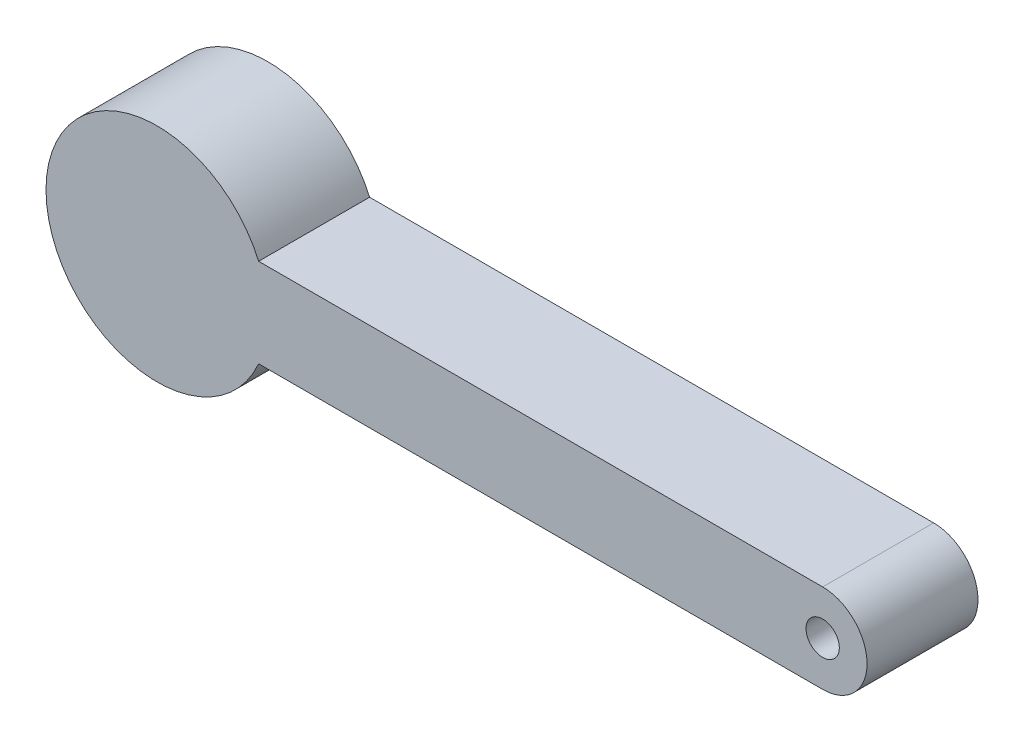
ISO-10303-21;
HEADER;
FILE_DESCRIPTION(('STEP AP214'),'2;1');
FILE_NAME('part.step','',(''),(''),'','','');
FILE_SCHEMA(('AUTOMOTIVE_DESIGN { 1 0 10303 214 1 1 1 1 }'));
ENDSEC;
DATA;
#1=APPLICATION_CONTEXT('core data for automotive mechanical design processes');
#2=APPLICATION_PROTOCOL_DEFINITION('international standard','automotive_design',2000,#1);
#3=PRODUCT_CONTEXT('',#1,'mechanical');
#4=PRODUCT('Part','Part','',(#3));
#5=PRODUCT_RELATED_PRODUCT_CATEGORY('part','',(#4));
#6=PRODUCT_DEFINITION_FORMATION('','',#4);
#7=PRODUCT_DEFINITION_CONTEXT('part definition',#1,'design');
#8=PRODUCT_DEFINITION('design','',#6,#7);
#9=PRODUCT_DEFINITION_SHAPE('','',#8);
#10=(LENGTH_UNIT() NAMED_UNIT(*) SI_UNIT(.MILLI.,.METRE.));
#11=(NAMED_UNIT(*) PLANE_ANGLE_UNIT() SI_UNIT($,.RADIAN.));
#12=(NAMED_UNIT(*) SI_UNIT($,.STERADIAN.) SOLID_ANGLE_UNIT());
#13=UNCERTAINTY_MEASURE_WITH_UNIT(LENGTH_MEASURE(1.E-05),#10,'distance_accuracy_value','');
#14=(GEOMETRIC_REPRESENTATION_CONTEXT(3) GLOBAL_UNCERTAINTY_ASSIGNED_CONTEXT((#13)) GLOBAL_UNIT_ASSIGNED_CONTEXT((#10,
#11,#12)) REPRESENTATION_CONTEXT('',''));
#15=CARTESIAN_POINT('',(0.,0.,0.));
#16=DIRECTION('',(0.,0.,1.));
#17=DIRECTION('',(1.,0.,0.));
#18=AXIS2_PLACEMENT_3D('',#15,#16,#17);
#19=CARTESIAN_POINT('',(30.,0.,-5.));
#20=DIRECTION('',(0.,0.,1.));
#21=DIRECTION('',(0.,-1.,0.));
#22=AXIS2_PLACEMENT_3D('',#19,#20,#21);
#23=CYLINDRICAL_SURFACE('',#22,1.5);
#24=CARTESIAN_POINT('',(30.,0.,-5.));
#25=DIRECTION('',(0.,0.,1.));
#26=DIRECTION('',(0.,-1.,0.));
#27=AXIS2_PLACEMENT_3D('',#24,#25,#26);
#28=CIRCLE('',#27,1.5);
#29=CARTESIAN_POINT('',(30.,-1.5,-5.));
#30=VERTEX_POINT('',#29);
#31=EDGE_CURVE('E82',#30,#30,#28,.F.);
#32=ORIENTED_EDGE('',*,*,#31,.T.);
#33=EDGE_LOOP('',(#32));
#34=FACE_BOUND('',#33,.T.);
#35=CARTESIAN_POINT('',(30.,0.,5.));
#36=DIRECTION('',(0.,0.,1.));
#37=DIRECTION('',(0.,-1.,0.));
#38=AXIS2_PLACEMENT_3D('',#35,#36,#37);
#39=CIRCLE('',#38,1.5);
#40=CARTESIAN_POINT('',(30.,-1.5,5.));
#41=VERTEX_POINT('',#40);
#42=EDGE_CURVE('E64',#41,#41,#39,.T.);
#43=ORIENTED_EDGE('',*,*,#42,.T.);
#44=EDGE_LOOP('',(#43));
#45=FACE_BOUND('',#44,.T.);
#46=ADVANCED_FACE('F16',(#34,#45),#23,.F.);
#47=CARTESIAN_POINT('',(-30.,0.,-5.));
#48=DIRECTION('',(0.,0.,1.));
#49=DIRECTION('',(0.,-1.,0.));
#50=AXIS2_PLACEMENT_3D('',#47,#48,#49);
#51=CYLINDRICAL_SURFACE('',#50,10.);
#52=DIRECTION('',(0.,0.,1.));
#53=VECTOR('',#52,1.);
#54=CARTESIAN_POINT('',(-20.83484861,-4.,0.));
#55=LINE('',#54,#53);
#56=CARTESIAN_POINT('',(-20.8348486100442,-4.,-5.));
#57=VERTEX_POINT('',#56);
#58=CARTESIAN_POINT('',(-20.8348486100442,-4.,5.));
#59=VERTEX_POINT('',#58);
#60=EDGE_CURVE('E59',#57,#59,#55,.T.);
#61=ORIENTED_EDGE('',*,*,#60,.T.);
#62=CARTESIAN_POINT('',(-30.,0.,5.));
#63=DIRECTION('',(0.,0.,1.));
#64=DIRECTION('',(0.,-1.,0.));
#65=AXIS2_PLACEMENT_3D('',#62,#63,#64);
#66=CIRCLE('',#65,10.0000000000809);
#67=CARTESIAN_POINT('',(-20.83484861,4.,5.));
#68=VERTEX_POINT('',#67);
#69=EDGE_CURVE('E19',#59,#68,#66,.F.);
#70=ORIENTED_EDGE('',*,*,#69,.T.);
#71=DIRECTION('',(0.,0.,-1.));
#72=VECTOR('',#71,1.);
#73=CARTESIAN_POINT('',(-20.83484861,4.,0.));
#74=LINE('',#73,#72);
#75=CARTESIAN_POINT('',(-20.83484861,4.,-5.));
#76=VERTEX_POINT('',#75);
#77=EDGE_CURVE('E57',#68,#76,#74,.T.);
#78=ORIENTED_EDGE('',*,*,#77,.T.);
#79=CARTESIAN_POINT('',(-30.,0.,-5.));
#80=DIRECTION('',(0.,0.,1.));
#81=DIRECTION('',(0.,-1.,0.));
#82=AXIS2_PLACEMENT_3D('',#79,#80,#81);
#83=CIRCLE('',#82,10.);
#84=EDGE_CURVE('E71',#76,#57,#83,.T.);
#85=ORIENTED_EDGE('',*,*,#84,.T.);
#86=EDGE_LOOP('',(#61,#70,#78,#85));
#87=FACE_BOUND('',#86,.T.);
#88=ADVANCED_FACE('F56',(#87),#51,.T.);
#89=CARTESIAN_POINT('',(0.,0.,5.));
#90=DIRECTION('',(0.,0.,1.));
#91=DIRECTION('',(1.,0.,0.));
#92=AXIS2_PLACEMENT_3D('',#89,#90,#91);
#93=PLANE('',#92);
#94=ORIENTED_EDGE('',*,*,#42,.F.);
#95=EDGE_LOOP('',(#94));
#96=FACE_BOUND('',#95,.T.);
#97=ORIENTED_EDGE('',*,*,#69,.F.);
#98=DIRECTION('',(1.,0.,0.));
#99=VECTOR('',#98,1.);
#100=CARTESIAN_POINT('',(0.,-4.,5.));
#101=LINE('',#100,#99);
#102=CARTESIAN_POINT('',(30.,-4.,5.));
#103=VERTEX_POINT('',#102);
#104=EDGE_CURVE('E80',#59,#103,#101,.T.);
#105=ORIENTED_EDGE('',*,*,#104,.T.);
#106=CARTESIAN_POINT('',(30.,0.,5.));
#107=DIRECTION('',(0.,0.,1.));
#108=DIRECTION('',(1.,0.,0.));
#109=AXIS2_PLACEMENT_3D('',#106,#107,#108);
#110=CIRCLE('',#109,4.);
#111=CARTESIAN_POINT('',(30.,4.,5.));
#112=VERTEX_POINT('',#111);
#113=EDGE_CURVE('E75',#103,#112,#110,.T.);
#114=ORIENTED_EDGE('',*,*,#113,.T.);
#115=DIRECTION('',(1.,0.,0.));
#116=VECTOR('',#115,1.);
#117=CARTESIAN_POINT('',(0.,4.,5.));
#118=LINE('',#117,#116);
#119=EDGE_CURVE('E68',#112,#68,#118,.F.);
#120=ORIENTED_EDGE('',*,*,#119,.T.);
#121=EDGE_LOOP('',(#97,#105,#114,#120));
#122=FACE_BOUND('',#121,.T.);
#123=ADVANCED_FACE('F74',(#96,#122),#93,.T.);
#124=CARTESIAN_POINT('',(0.,4.,0.));
#125=DIRECTION('',(0.,-1.,0.));
#126=DIRECTION('',(0.,0.,-1.));
#127=AXIS2_PLACEMENT_3D('',#124,#125,#126);
#128=PLANE('',#127);
#129=ORIENTED_EDGE('',*,*,#119,.F.);
#130=DIRECTION('',(0.,0.,-1.));
#131=VECTOR('',#130,1.);
#132=CARTESIAN_POINT('',(30.,4.,0.));
#133=LINE('',#132,#131);
#134=CARTESIAN_POINT('',(30.,4.,-5.));
#135=VERTEX_POINT('',#134);
#136=EDGE_CURVE('E86',#112,#135,#133,.T.);
#137=ORIENTED_EDGE('',*,*,#136,.T.);
#138=DIRECTION('',(1.,0.,0.));
#139=VECTOR('',#138,1.);
#140=CARTESIAN_POINT('',(0.,4.,-5.));
#141=LINE('',#140,#139);
#142=EDGE_CURVE('E70',#135,#76,#141,.F.);
#143=ORIENTED_EDGE('',*,*,#142,.T.);
#144=ORIENTED_EDGE('',*,*,#77,.F.);
#145=EDGE_LOOP('',(#129,#137,#143,#144));
#146=FACE_BOUND('',#145,.T.);
#147=ADVANCED_FACE('F66',(#146),#128,.F.);
#148=CARTESIAN_POINT('',(0.,0.,-5.));
#149=DIRECTION('',(0.,0.,1.));
#150=DIRECTION('',(1.,0.,0.));
#151=AXIS2_PLACEMENT_3D('',#148,#149,#150);
#152=PLANE('',#151);
#153=ORIENTED_EDGE('',*,*,#31,.F.);
#154=EDGE_LOOP('',(#153));
#155=FACE_BOUND('',#154,.T.);
#156=CARTESIAN_POINT('',(30.,0.,-5.));
#157=DIRECTION('',(0.,0.,1.));
#158=DIRECTION('',(1.,0.,0.));
#159=AXIS2_PLACEMENT_3D('',#156,#157,#158);
#160=CIRCLE('',#159,4.);
#161=CARTESIAN_POINT('',(30.,-4.,-5.));
#162=VERTEX_POINT('',#161);
#163=EDGE_CURVE('E25',#135,#162,#160,.F.);
#164=ORIENTED_EDGE('',*,*,#163,.T.);
#165=DIRECTION('',(1.,0.,0.));
#166=VECTOR('',#165,1.);
#167=CARTESIAN_POINT('',(0.,-4.,-5.));
#168=LINE('',#167,#166);
#169=EDGE_CURVE('E33',#162,#57,#168,.F.);
#170=ORIENTED_EDGE('',*,*,#169,.T.);
#171=ORIENTED_EDGE('',*,*,#84,.F.);
#172=ORIENTED_EDGE('',*,*,#142,.F.);
#173=EDGE_LOOP('',(#164,#170,#171,#172));
#174=FACE_BOUND('',#173,.T.);
#175=ADVANCED_FACE('F96',(#155,#174),#152,.F.);
#176=CARTESIAN_POINT('',(0.,-4.,0.));
#177=DIRECTION('',(0.,1.,0.));
#178=DIRECTION('',(0.,0.,1.));
#179=AXIS2_PLACEMENT_3D('',#176,#177,#178);
#180=PLANE('',#179);
#181=ORIENTED_EDGE('',*,*,#169,.F.);
#182=DIRECTION('',(0.,0.,1.));
#183=VECTOR('',#182,1.);
#184=CARTESIAN_POINT('',(30.,-4.,0.));
#185=LINE('',#184,#183);
#186=EDGE_CURVE('E10',#162,#103,#185,.T.);
#187=ORIENTED_EDGE('',*,*,#186,.T.);
#188=ORIENTED_EDGE('',*,*,#104,.F.);
#189=ORIENTED_EDGE('',*,*,#60,.F.);
#190=EDGE_LOOP('',(#181,#187,#188,#189));
#191=FACE_BOUND('',#190,.T.);
#192=ADVANCED_FACE('F98',(#191),#180,.F.);
#193=CARTESIAN_POINT('',(30.,0.,-5.));
#194=DIRECTION('',(0.,0.,1.));
#195=DIRECTION('',(1.,0.,0.));
#196=AXIS2_PLACEMENT_3D('',#193,#194,#195);
#197=CYLINDRICAL_SURFACE('',#196,4.);
#198=ORIENTED_EDGE('',*,*,#163,.F.);
#199=ORIENTED_EDGE('',*,*,#136,.F.);
#200=ORIENTED_EDGE('',*,*,#113,.F.);
#201=ORIENTED_EDGE('',*,*,#186,.F.);
#202=EDGE_LOOP('',(#198,#199,#200,#201));
#203=FACE_BOUND('',#202,.T.);
#204=ADVANCED_FACE('F94',(#203),#197,.T.);
#205=CLOSED_SHELL('',(#46,#88,#123,#147,#175,#192,#204));
#206=MANIFOLD_SOLID_BREP('B1',#205);
#207=ADVANCED_BREP_SHAPE_REPRESENTATION('',(#18,#206),#14);
#208=SHAPE_DEFINITION_REPRESENTATION(#9,#207);
ENDSEC;
END-ISO-10303-21;
